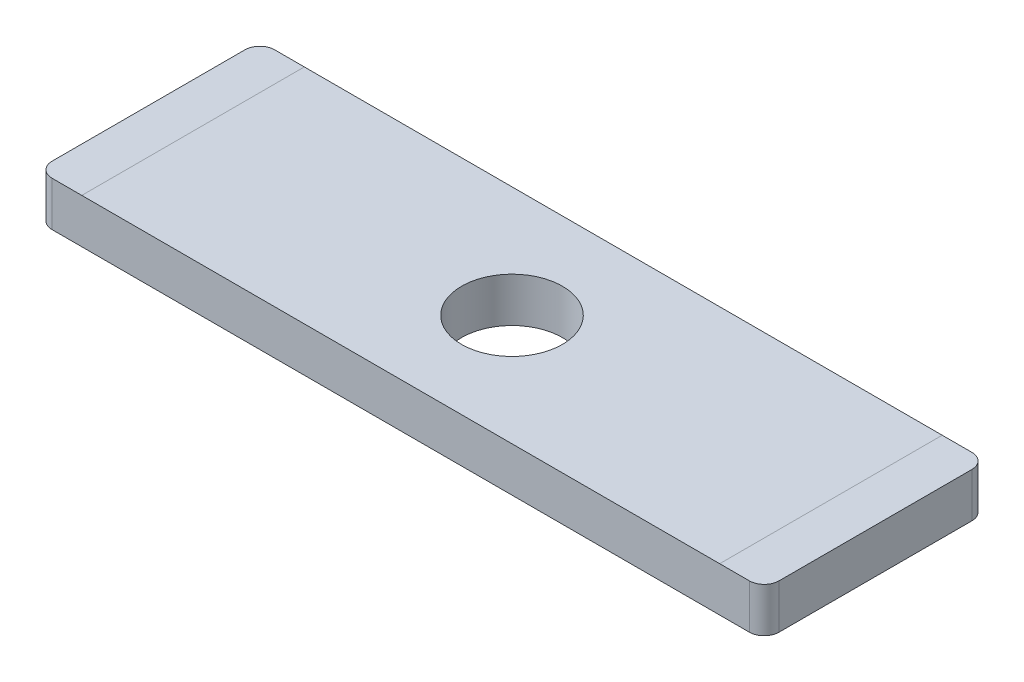
ISO-10303-21;
HEADER;
FILE_DESCRIPTION(('STEP AP214'),'2;1');
FILE_NAME('part.step','',(''),(''),'','','');
FILE_SCHEMA(('AUTOMOTIVE_DESIGN { 1 0 10303 214 1 1 1 1 }'));
ENDSEC;
DATA;
#1=APPLICATION_CONTEXT('core data for automotive mechanical design processes');
#2=APPLICATION_PROTOCOL_DEFINITION('international standard','automotive_design',2000,#1);
#3=PRODUCT_CONTEXT('',#1,'mechanical');
#4=PRODUCT('Part','Part','',(#3));
#5=PRODUCT_RELATED_PRODUCT_CATEGORY('part','',(#4));
#6=PRODUCT_DEFINITION_FORMATION('','',#4);
#7=PRODUCT_DEFINITION_CONTEXT('part definition',#1,'design');
#8=PRODUCT_DEFINITION('design','',#6,#7);
#9=PRODUCT_DEFINITION_SHAPE('','',#8);
#10=(LENGTH_UNIT() NAMED_UNIT(*) SI_UNIT(.MILLI.,.METRE.));
#11=(NAMED_UNIT(*) PLANE_ANGLE_UNIT() SI_UNIT($,.RADIAN.));
#12=(NAMED_UNIT(*) SI_UNIT($,.STERADIAN.) SOLID_ANGLE_UNIT());
#13=UNCERTAINTY_MEASURE_WITH_UNIT(LENGTH_MEASURE(1.E-05),#10,'distance_accuracy_value','');
#14=(GEOMETRIC_REPRESENTATION_CONTEXT(3) GLOBAL_UNCERTAINTY_ASSIGNED_CONTEXT((#13)) GLOBAL_UNIT_ASSIGNED_CONTEXT((#10,
#11,#12)) REPRESENTATION_CONTEXT('',''));
#15=CARTESIAN_POINT('',(0.,0.,0.));
#16=DIRECTION('',(0.,0.,1.));
#17=DIRECTION('',(1.,0.,0.));
#18=AXIS2_PLACEMENT_3D('',#15,#16,#17);
#19=CARTESIAN_POINT('',(0.,0.,0.));
#20=DIRECTION('',(0.,1.,0.));
#21=DIRECTION('',(0.,0.,1.));
#22=AXIS2_PLACEMENT_3D('',#19,#20,#21);
#23=PLANE('',#22);
#24=CARTESIAN_POINT('',(0.,0.,0.));
#25=DIRECTION('',(0.,1.,0.));
#26=DIRECTION('',(0.,0.,1.));
#27=AXIS2_PLACEMENT_3D('',#24,#25,#26);
#28=CIRCLE('',#27,3.4);
#29=CARTESIAN_POINT('',(0.,0.,3.4));
#30=VERTEX_POINT('',#29);
#31=EDGE_CURVE('E256',#30,#30,#28,.T.);
#32=ORIENTED_EDGE('',*,*,#31,.T.);
#33=EDGE_LOOP('',(#32));
#34=FACE_BOUND('',#33,.T.);
#35=DIRECTION('',(0.,0.,-1.));
#36=VECTOR('',#35,1.);
#37=CARTESIAN_POINT('',(21.5,0.,0.));
#38=LINE('',#37,#36);
#39=CARTESIAN_POINT('',(21.5,0.,7.5));
#40=VERTEX_POINT('',#39);
#41=CARTESIAN_POINT('',(21.5,0.,-7.5));
#42=VERTEX_POINT('',#41);
#43=EDGE_CURVE('E12',#40,#42,#38,.T.);
#44=ORIENTED_EDGE('',*,*,#43,.F.);
#45=DIRECTION('',(1.,0.,0.));
#46=VECTOR('',#45,1.);
#47=CARTESIAN_POINT('',(-24.5,0.,7.5));
#48=LINE('',#47,#46);
#49=CARTESIAN_POINT('',(-21.5,0.,7.5));
#50=VERTEX_POINT('',#49);
#51=EDGE_CURVE('E185',#50,#40,#48,.T.);
#52=ORIENTED_EDGE('',*,*,#51,.F.);
#53=DIRECTION('',(0.,0.,1.));
#54=VECTOR('',#53,1.);
#55=CARTESIAN_POINT('',(-21.5,0.,0.));
#56=LINE('',#55,#54);
#57=CARTESIAN_POINT('',(-21.5,0.,-7.5));
#58=VERTEX_POINT('',#57);
#59=EDGE_CURVE('E275',#58,#50,#56,.T.);
#60=ORIENTED_EDGE('',*,*,#59,.F.);
#61=DIRECTION('',(-1.,0.,0.));
#62=VECTOR('',#61,1.);
#63=CARTESIAN_POINT('',(-24.5,0.,-7.5));
#64=LINE('',#63,#62);
#65=EDGE_CURVE('E164',#42,#58,#64,.T.);
#66=ORIENTED_EDGE('',*,*,#65,.F.);
#67=EDGE_LOOP('',(#44,#52,#60,#66));
#68=FACE_BOUND('',#67,.T.);
#69=ADVANCED_FACE('F51',(#34,#68),#23,.F.);
#70=CARTESIAN_POINT('',(0.,3.,0.));
#71=DIRECTION('',(0.,1.,0.));
#72=DIRECTION('',(0.,0.,1.));
#73=AXIS2_PLACEMENT_3D('',#70,#71,#72);
#74=PLANE('',#73);
#75=CARTESIAN_POINT('',(0.,3.,0.));
#76=DIRECTION('',(0.,1.,0.));
#77=DIRECTION('',(0.,0.,1.));
#78=AXIS2_PLACEMENT_3D('',#75,#76,#77);
#79=CIRCLE('',#78,3.4);
#80=CARTESIAN_POINT('',(0.,3.,3.4));
#81=VERTEX_POINT('',#80);
#82=EDGE_CURVE('E251',#81,#81,#79,.T.);
#83=ORIENTED_EDGE('',*,*,#82,.F.);
#84=EDGE_LOOP('',(#83));
#85=FACE_BOUND('',#84,.T.);
#86=DIRECTION('',(1.,0.,0.));
#87=VECTOR('',#86,1.);
#88=CARTESIAN_POINT('',(-24.5,3.,7.5));
#89=LINE('',#88,#87);
#90=CARTESIAN_POINT('',(-21.5,3.,7.5));
#91=VERTEX_POINT('',#90);
#92=CARTESIAN_POINT('',(21.5,3.,7.5));
#93=VERTEX_POINT('',#92);
#94=EDGE_CURVE('E203',#91,#93,#89,.T.);
#95=ORIENTED_EDGE('',*,*,#94,.T.);
#96=DIRECTION('',(0.,0.,-1.));
#97=VECTOR('',#96,1.);
#98=CARTESIAN_POINT('',(21.5,3.,0.));
#99=LINE('',#98,#97);
#100=CARTESIAN_POINT('',(21.5,3.,-7.5));
#101=VERTEX_POINT('',#100);
#102=EDGE_CURVE('E55',#93,#101,#99,.T.);
#103=ORIENTED_EDGE('',*,*,#102,.T.);
#104=DIRECTION('',(-1.,0.,0.));
#105=VECTOR('',#104,1.);
#106=CARTESIAN_POINT('',(-24.5,3.,-7.5));
#107=LINE('',#106,#105);
#108=CARTESIAN_POINT('',(-21.5,3.,-7.5));
#109=VERTEX_POINT('',#108);
#110=EDGE_CURVE('E209',#101,#109,#107,.T.);
#111=ORIENTED_EDGE('',*,*,#110,.T.);
#112=DIRECTION('',(0.,0.,1.));
#113=VECTOR('',#112,1.);
#114=CARTESIAN_POINT('',(-21.5,3.,0.));
#115=LINE('',#114,#113);
#116=EDGE_CURVE('E221',#109,#91,#115,.T.);
#117=ORIENTED_EDGE('',*,*,#116,.T.);
#118=EDGE_LOOP('',(#95,#103,#111,#117));
#119=FACE_BOUND('',#118,.T.);
#120=ADVANCED_FACE('F311',(#85,#119),#74,.T.);
#121=CARTESIAN_POINT('',(23.5,0.,7.5));
#122=VERTEX_POINT('',#121);
#123=EDGE_CURVE('E187',#40,#122,#48,.T.);
#124=ORIENTED_EDGE('',*,*,#123,.F.);
#125=ORIENTED_EDGE('',*,*,#43,.T.);
#126=CARTESIAN_POINT('',(23.5,0.,-7.5));
#127=VERTEX_POINT('',#126);
#128=EDGE_CURVE('E153',#127,#42,#64,.T.);
#129=ORIENTED_EDGE('',*,*,#128,.F.);
#130=CARTESIAN_POINT('',(23.5,0.,-6.5));
#131=DIRECTION('',(0.,1.,0.));
#132=DIRECTION('',(0.,0.,1.));
#133=AXIS2_PLACEMENT_3D('',#130,#131,#132);
#134=CIRCLE('',#133,1.);
#135=CARTESIAN_POINT('',(24.5,0.,-6.5));
#136=VERTEX_POINT('',#135);
#137=EDGE_CURVE('E137',#127,#136,#134,.F.);
#138=ORIENTED_EDGE('',*,*,#137,.T.);
#139=DIRECTION('',(0.,0.,-1.));
#140=VECTOR('',#139,1.);
#141=CARTESIAN_POINT('',(24.5,0.,-7.5));
#142=LINE('',#141,#140);
#143=CARTESIAN_POINT('',(24.5,0.,6.5));
#144=VERTEX_POINT('',#143);
#145=EDGE_CURVE('E175',#144,#136,#142,.T.);
#146=ORIENTED_EDGE('',*,*,#145,.F.);
#147=CARTESIAN_POINT('',(23.5,0.,6.5));
#148=DIRECTION('',(0.,1.,0.));
#149=DIRECTION('',(0.,0.,1.));
#150=AXIS2_PLACEMENT_3D('',#147,#148,#149);
#151=CIRCLE('',#150,1.);
#152=EDGE_CURVE('E147',#144,#122,#151,.F.);
#153=ORIENTED_EDGE('',*,*,#152,.T.);
#154=EDGE_LOOP('',(#124,#125,#129,#138,#146,#153));
#155=FACE_BOUND('',#154,.T.);
#156=ADVANCED_FACE('F161',(#155),#23,.F.);
#157=ORIENTED_EDGE('',*,*,#102,.F.);
#158=CARTESIAN_POINT('',(23.5,3.,7.5));
#159=VERTEX_POINT('',#158);
#160=EDGE_CURVE('E170',#93,#159,#89,.T.);
#161=ORIENTED_EDGE('',*,*,#160,.T.);
#162=CARTESIAN_POINT('',(23.5,3.,6.5));
#163=DIRECTION('',(0.,1.,0.));
#164=DIRECTION('',(0.,0.,1.));
#165=AXIS2_PLACEMENT_3D('',#162,#163,#164);
#166=CIRCLE('',#165,1.);
#167=CARTESIAN_POINT('',(24.5,3.,6.5));
#168=VERTEX_POINT('',#167);
#169=EDGE_CURVE('E229',#159,#168,#166,.T.);
#170=ORIENTED_EDGE('',*,*,#169,.T.);
#171=DIRECTION('',(0.,0.,-1.));
#172=VECTOR('',#171,1.);
#173=CARTESIAN_POINT('',(24.5,3.,-7.5));
#174=LINE('',#173,#172);
#175=CARTESIAN_POINT('',(24.5,3.,-6.5));
#176=VERTEX_POINT('',#175);
#177=EDGE_CURVE('E202',#168,#176,#174,.T.);
#178=ORIENTED_EDGE('',*,*,#177,.T.);
#179=CARTESIAN_POINT('',(23.5,3.,-6.5));
#180=DIRECTION('',(0.,1.,0.));
#181=DIRECTION('',(0.,0.,1.));
#182=AXIS2_PLACEMENT_3D('',#179,#180,#181);
#183=CIRCLE('',#182,1.);
#184=CARTESIAN_POINT('',(23.5,3.,-7.5));
#185=VERTEX_POINT('',#184);
#186=EDGE_CURVE('E233',#176,#185,#183,.T.);
#187=ORIENTED_EDGE('',*,*,#186,.T.);
#188=EDGE_CURVE('E156',#185,#101,#107,.T.);
#189=ORIENTED_EDGE('',*,*,#188,.T.);
#190=EDGE_LOOP('',(#157,#161,#170,#178,#187,#189));
#191=FACE_BOUND('',#190,.T.);
#192=ADVANCED_FACE('F293',(#191),#74,.T.);
#193=CARTESIAN_POINT('',(-24.5,3.,-7.5));
#194=DIRECTION('',(1.,0.,0.));
#195=DIRECTION('',(0.,0.,-1.));
#196=AXIS2_PLACEMENT_3D('',#193,#194,#195);
#197=PLANE('',#196);
#198=DIRECTION('',(0.,0.,1.));
#199=VECTOR('',#198,1.);
#200=CARTESIAN_POINT('',(-24.5,3.,-7.5));
#201=LINE('',#200,#199);
#202=CARTESIAN_POINT('',(-24.5,3.,-6.5));
#203=VERTEX_POINT('',#202);
#204=CARTESIAN_POINT('',(-24.5,3.,6.5));
#205=VERTEX_POINT('',#204);
#206=EDGE_CURVE('E163',#203,#205,#201,.T.);
#207=ORIENTED_EDGE('',*,*,#206,.F.);
#208=DIRECTION('',(0.,-1.,0.));
#209=VECTOR('',#208,1.);
#210=CARTESIAN_POINT('',(-24.5,3.,-6.5));
#211=LINE('',#210,#209);
#212=CARTESIAN_POINT('',(-24.5,0.,-6.5));
#213=VERTEX_POINT('',#212);
#214=EDGE_CURVE('E227',#203,#213,#211,.T.);
#215=ORIENTED_EDGE('',*,*,#214,.T.);
#216=DIRECTION('',(0.,0.,1.));
#217=VECTOR('',#216,1.);
#218=CARTESIAN_POINT('',(-24.5,0.,-7.5));
#219=LINE('',#218,#217);
#220=CARTESIAN_POINT('',(-24.5,0.,6.5));
#221=VERTEX_POINT('',#220);
#222=EDGE_CURVE('E190',#213,#221,#219,.T.);
#223=ORIENTED_EDGE('',*,*,#222,.T.);
#224=DIRECTION('',(0.,-1.,0.));
#225=VECTOR('',#224,1.);
#226=CARTESIAN_POINT('',(-24.5,3.,6.5));
#227=LINE('',#226,#225);
#228=EDGE_CURVE('E300',#221,#205,#227,.F.);
#229=ORIENTED_EDGE('',*,*,#228,.T.);
#230=EDGE_LOOP('',(#207,#215,#223,#229));
#231=FACE_BOUND('',#230,.T.);
#232=ADVANCED_FACE('F342',(#231),#197,.F.);
#233=CARTESIAN_POINT('',(-24.5,3.,7.5));
#234=DIRECTION('',(0.,0.,-1.));
#235=DIRECTION('',(-1.,0.,0.));
#236=AXIS2_PLACEMENT_3D('',#233,#234,#235);
#237=PLANE('',#236);
#238=CARTESIAN_POINT('',(-23.5,0.,7.5));
#239=VERTEX_POINT('',#238);
#240=EDGE_CURVE('E180',#239,#50,#48,.T.);
#241=ORIENTED_EDGE('',*,*,#240,.T.);
#242=ORIENTED_EDGE('',*,*,#51,.T.);
#243=ORIENTED_EDGE('',*,*,#123,.T.);
#244=DIRECTION('',(0.,-1.,0.));
#245=VECTOR('',#244,1.);
#246=CARTESIAN_POINT('',(23.5,3.,7.5));
#247=LINE('',#246,#245);
#248=EDGE_CURVE('E247',#122,#159,#247,.F.);
#249=ORIENTED_EDGE('',*,*,#248,.T.);
#250=ORIENTED_EDGE('',*,*,#160,.F.);
#251=ORIENTED_EDGE('',*,*,#94,.F.);
#252=CARTESIAN_POINT('',(-23.5,3.,7.5));
#253=VERTEX_POINT('',#252);
#254=EDGE_CURVE('E197',#253,#91,#89,.T.);
#255=ORIENTED_EDGE('',*,*,#254,.F.);
#256=DIRECTION('',(0.,-1.,0.));
#257=VECTOR('',#256,1.);
#258=CARTESIAN_POINT('',(-23.5,3.,7.5));
#259=LINE('',#258,#257);
#260=EDGE_CURVE('E242',#253,#239,#259,.T.);
#261=ORIENTED_EDGE('',*,*,#260,.T.);
#262=EDGE_LOOP('',(#241,#242,#243,#249,#250,#251,#255,#261));
#263=FACE_BOUND('',#262,.T.);
#264=ADVANCED_FACE('F272',(#263),#237,.F.);
#265=CARTESIAN_POINT('',(24.5,3.,-7.5));
#266=DIRECTION('',(-1.,0.,0.));
#267=DIRECTION('',(0.,0.,1.));
#268=AXIS2_PLACEMENT_3D('',#265,#266,#267);
#269=PLANE('',#268);
#270=ORIENTED_EDGE('',*,*,#145,.T.);
#271=DIRECTION('',(0.,-1.,0.));
#272=VECTOR('',#271,1.);
#273=CARTESIAN_POINT('',(24.5,3.,-6.5));
#274=LINE('',#273,#272);
#275=EDGE_CURVE('E142',#136,#176,#274,.F.);
#276=ORIENTED_EDGE('',*,*,#275,.T.);
#277=ORIENTED_EDGE('',*,*,#177,.F.);
#278=DIRECTION('',(0.,-1.,0.));
#279=VECTOR('',#278,1.);
#280=CARTESIAN_POINT('',(24.5,3.,6.5));
#281=LINE('',#280,#279);
#282=EDGE_CURVE('E146',#168,#144,#281,.T.);
#283=ORIENTED_EDGE('',*,*,#282,.T.);
#284=EDGE_LOOP('',(#270,#276,#277,#283));
#285=FACE_BOUND('',#284,.T.);
#286=ADVANCED_FACE('F291',(#285),#269,.F.);
#287=CARTESIAN_POINT('',(-24.5,3.,-7.5));
#288=DIRECTION('',(0.,0.,1.));
#289=DIRECTION('',(1.,0.,0.));
#290=AXIS2_PLACEMENT_3D('',#287,#288,#289);
#291=PLANE('',#290);
#292=ORIENTED_EDGE('',*,*,#188,.F.);
#293=DIRECTION('',(0.,-1.,0.));
#294=VECTOR('',#293,1.);
#295=CARTESIAN_POINT('',(23.5,3.,-7.5));
#296=LINE('',#295,#294);
#297=EDGE_CURVE('E141',#185,#127,#296,.T.);
#298=ORIENTED_EDGE('',*,*,#297,.T.);
#299=ORIENTED_EDGE('',*,*,#128,.T.);
#300=ORIENTED_EDGE('',*,*,#65,.T.);
#301=CARTESIAN_POINT('',(-23.5,0.,-7.5));
#302=VERTEX_POINT('',#301);
#303=EDGE_CURVE('E166',#58,#302,#64,.T.);
#304=ORIENTED_EDGE('',*,*,#303,.T.);
#305=DIRECTION('',(0.,-1.,0.));
#306=VECTOR('',#305,1.);
#307=CARTESIAN_POINT('',(-23.5,3.,-7.5));
#308=LINE('',#307,#306);
#309=CARTESIAN_POINT('',(-23.5,3.,-7.5));
#310=VERTEX_POINT('',#309);
#311=EDGE_CURVE('E159',#302,#310,#308,.F.);
#312=ORIENTED_EDGE('',*,*,#311,.T.);
#313=EDGE_CURVE('E207',#109,#310,#107,.T.);
#314=ORIENTED_EDGE('',*,*,#313,.F.);
#315=ORIENTED_EDGE('',*,*,#110,.F.);
#316=EDGE_LOOP('',(#292,#298,#299,#300,#304,#312,#314,#315));
#317=FACE_BOUND('',#316,.T.);
#318=ADVANCED_FACE('F152',(#317),#291,.F.);
#319=ORIENTED_EDGE('',*,*,#116,.F.);
#320=ORIENTED_EDGE('',*,*,#313,.T.);
#321=CARTESIAN_POINT('',(-23.5,3.,-6.5));
#322=DIRECTION('',(0.,1.,0.));
#323=DIRECTION('',(0.,0.,1.));
#324=AXIS2_PLACEMENT_3D('',#321,#322,#323);
#325=CIRCLE('',#324,1.);
#326=EDGE_CURVE('E219',#310,#203,#325,.T.);
#327=ORIENTED_EDGE('',*,*,#326,.T.);
#328=ORIENTED_EDGE('',*,*,#206,.T.);
#329=CARTESIAN_POINT('',(-23.5,3.,6.5));
#330=DIRECTION('',(0.,1.,0.));
#331=DIRECTION('',(0.,0.,1.));
#332=AXIS2_PLACEMENT_3D('',#329,#330,#331);
#333=CIRCLE('',#332,1.);
#334=EDGE_CURVE('E230',#205,#253,#333,.T.);
#335=ORIENTED_EDGE('',*,*,#334,.T.);
#336=ORIENTED_EDGE('',*,*,#254,.T.);
#337=EDGE_LOOP('',(#319,#320,#327,#328,#335,#336));
#338=FACE_BOUND('',#337,.T.);
#339=ADVANCED_FACE('F217',(#338),#74,.T.);
#340=ORIENTED_EDGE('',*,*,#303,.F.);
#341=ORIENTED_EDGE('',*,*,#59,.T.);
#342=ORIENTED_EDGE('',*,*,#240,.F.);
#343=CARTESIAN_POINT('',(-23.5,0.,6.5));
#344=DIRECTION('',(0.,1.,0.));
#345=DIRECTION('',(0.,0.,1.));
#346=AXIS2_PLACEMENT_3D('',#343,#344,#345);
#347=CIRCLE('',#346,1.);
#348=EDGE_CURVE('E158',#239,#221,#347,.F.);
#349=ORIENTED_EDGE('',*,*,#348,.T.);
#350=ORIENTED_EDGE('',*,*,#222,.F.);
#351=CARTESIAN_POINT('',(-23.5,0.,-6.5));
#352=DIRECTION('',(0.,1.,0.));
#353=DIRECTION('',(0.,0.,1.));
#354=AXIS2_PLACEMENT_3D('',#351,#352,#353);
#355=CIRCLE('',#354,1.);
#356=EDGE_CURVE('E280',#213,#302,#355,.F.);
#357=ORIENTED_EDGE('',*,*,#356,.T.);
#358=EDGE_LOOP('',(#340,#341,#342,#349,#350,#357));
#359=FACE_BOUND('',#358,.T.);
#360=ADVANCED_FACE('F279',(#359),#23,.F.);
#361=CARTESIAN_POINT('',(0.,0.,0.));
#362=DIRECTION('',(0.,1.,0.));
#363=DIRECTION('',(0.,0.,1.));
#364=AXIS2_PLACEMENT_3D('',#361,#362,#363);
#365=CYLINDRICAL_SURFACE('',#364,3.4);
#366=ORIENTED_EDGE('',*,*,#31,.F.);
#367=EDGE_LOOP('',(#366));
#368=FACE_BOUND('',#367,.T.);
#369=ORIENTED_EDGE('',*,*,#82,.T.);
#370=EDGE_LOOP('',(#369));
#371=FACE_BOUND('',#370,.T.);
#372=ADVANCED_FACE('F332',(#368,#371),#365,.F.);
#373=CARTESIAN_POINT('',(23.5,3.,-6.5));
#374=DIRECTION('',(0.,-1.,0.));
#375=DIRECTION('',(0.,0.,-1.));
#376=AXIS2_PLACEMENT_3D('',#373,#374,#375);
#377=CYLINDRICAL_SURFACE('',#376,1.);
#378=ORIENTED_EDGE('',*,*,#186,.F.);
#379=ORIENTED_EDGE('',*,*,#275,.F.);
#380=ORIENTED_EDGE('',*,*,#137,.F.);
#381=ORIENTED_EDGE('',*,*,#297,.F.);
#382=EDGE_LOOP('',(#378,#379,#380,#381));
#383=FACE_BOUND('',#382,.T.);
#384=ADVANCED_FACE('F140',(#383),#377,.T.);
#385=CARTESIAN_POINT('',(23.5,3.,6.5));
#386=DIRECTION('',(0.,-1.,0.));
#387=DIRECTION('',(0.,0.,-1.));
#388=AXIS2_PLACEMENT_3D('',#385,#386,#387);
#389=CYLINDRICAL_SURFACE('',#388,1.);
#390=ORIENTED_EDGE('',*,*,#169,.F.);
#391=ORIENTED_EDGE('',*,*,#248,.F.);
#392=ORIENTED_EDGE('',*,*,#152,.F.);
#393=ORIENTED_EDGE('',*,*,#282,.F.);
#394=EDGE_LOOP('',(#390,#391,#392,#393));
#395=FACE_BOUND('',#394,.T.);
#396=ADVANCED_FACE('F298',(#395),#389,.T.);
#397=CARTESIAN_POINT('',(-23.5,3.,-6.5));
#398=DIRECTION('',(0.,-1.,0.));
#399=DIRECTION('',(0.,0.,-1.));
#400=AXIS2_PLACEMENT_3D('',#397,#398,#399);
#401=CYLINDRICAL_SURFACE('',#400,1.);
#402=ORIENTED_EDGE('',*,*,#326,.F.);
#403=ORIENTED_EDGE('',*,*,#311,.F.);
#404=ORIENTED_EDGE('',*,*,#356,.F.);
#405=ORIENTED_EDGE('',*,*,#214,.F.);
#406=EDGE_LOOP('',(#402,#403,#404,#405));
#407=FACE_BOUND('',#406,.T.);
#408=ADVANCED_FACE('F225',(#407),#401,.T.);
#409=CARTESIAN_POINT('',(-23.5,3.,6.5));
#410=DIRECTION('',(0.,-1.,0.));
#411=DIRECTION('',(0.,0.,-1.));
#412=AXIS2_PLACEMENT_3D('',#409,#410,#411);
#413=CYLINDRICAL_SURFACE('',#412,1.);
#414=ORIENTED_EDGE('',*,*,#334,.F.);
#415=ORIENTED_EDGE('',*,*,#228,.F.);
#416=ORIENTED_EDGE('',*,*,#348,.F.);
#417=ORIENTED_EDGE('',*,*,#260,.F.);
#418=EDGE_LOOP('',(#414,#415,#416,#417));
#419=FACE_BOUND('',#418,.T.);
#420=ADVANCED_FACE('F53',(#419),#413,.T.);
#421=CLOSED_SHELL('',(#69,#120,#156,#192,#232,#264,#286,#318,#339,#360,#372,#384,#396,#408,#420));
#422=MANIFOLD_SOLID_BREP('B2',#421);
#423=ADVANCED_BREP_SHAPE_REPRESENTATION('',(#18,#422),#14);
#424=SHAPE_DEFINITION_REPRESENTATION(#9,#423);
ENDSEC;
END-ISO-10303-21;
